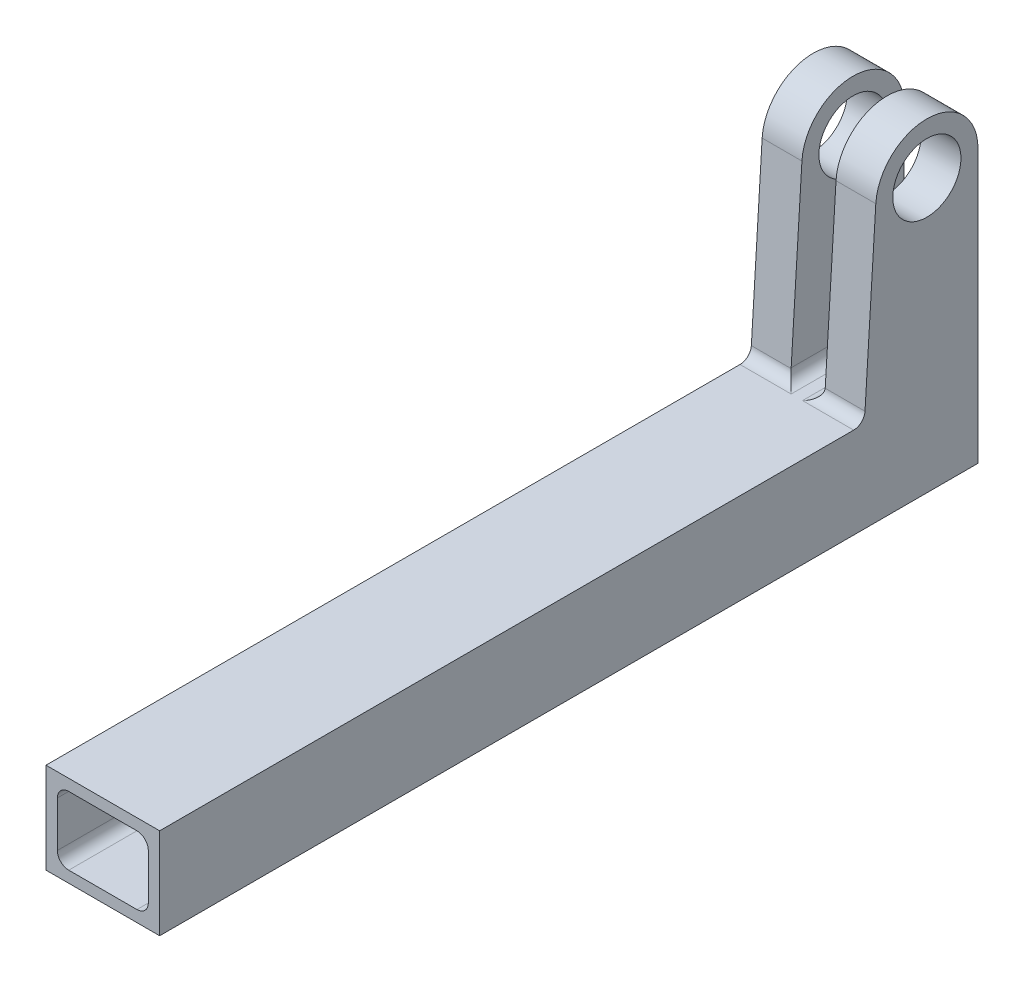
ISO-10303-21;
HEADER;
FILE_DESCRIPTION(('STEP AP214'),'2;1');
FILE_NAME('part.step','',(''),(''),'','','');
FILE_SCHEMA(('AUTOMOTIVE_DESIGN { 1 0 10303 214 1 1 1 1 }'));
ENDSEC;
DATA;
#1=APPLICATION_CONTEXT('core data for automotive mechanical design processes');
#2=APPLICATION_PROTOCOL_DEFINITION('international standard','automotive_design',2000,#1);
#3=PRODUCT_CONTEXT('',#1,'mechanical');
#4=PRODUCT('Part','Part','',(#3));
#5=PRODUCT_RELATED_PRODUCT_CATEGORY('part','',(#4));
#6=PRODUCT_DEFINITION_FORMATION('','',#4);
#7=PRODUCT_DEFINITION_CONTEXT('part definition',#1,'design');
#8=PRODUCT_DEFINITION('design','',#6,#7);
#9=PRODUCT_DEFINITION_SHAPE('','',#8);
#10=(LENGTH_UNIT() NAMED_UNIT(*) SI_UNIT(.MILLI.,.METRE.));
#11=(NAMED_UNIT(*) PLANE_ANGLE_UNIT() SI_UNIT($,.RADIAN.));
#12=(NAMED_UNIT(*) SI_UNIT($,.STERADIAN.) SOLID_ANGLE_UNIT());
#13=UNCERTAINTY_MEASURE_WITH_UNIT(LENGTH_MEASURE(1.E-05),#10,'distance_accuracy_value','');
#14=(GEOMETRIC_REPRESENTATION_CONTEXT(3) GLOBAL_UNCERTAINTY_ASSIGNED_CONTEXT((#13)) GLOBAL_UNIT_ASSIGNED_CONTEXT((#10,
#11,#12)) REPRESENTATION_CONTEXT('',''));
#15=CARTESIAN_POINT('',(0.,0.,0.));
#16=DIRECTION('',(0.,0.,1.));
#17=DIRECTION('',(1.,0.,0.));
#18=AXIS2_PLACEMENT_3D('',#15,#16,#17);
#19=CARTESIAN_POINT('',(0.,101.6,914.4));
#20=DIRECTION('',(0.,-1.,0.));
#21=DIRECTION('',(1.,0.,0.));
#22=AXIS2_PLACEMENT_3D('',#19,#20,#21);
#23=PLANE('',#22);
#24=DIRECTION('',(0.,0.,1.));
#25=VECTOR('',#24,1.);
#26=CARTESIAN_POINT('',(-69.8500000000001,101.6,127.));
#27=LINE('',#26,#25);
#28=CARTESIAN_POINT('',(-69.8500000000001,101.6,0.));
#29=VERTEX_POINT('',#28);
#30=CARTESIAN_POINT('',(-69.8500000000001,101.6,138.937454927375));
#31=VERTEX_POINT('',#30);
#32=EDGE_CURVE('E346',#29,#31,#27,.T.);
#33=ORIENTED_EDGE('',*,*,#32,.T.);
#34=DIRECTION('',(-1.,0.,0.));
#35=VECTOR('',#34,1.);
#36=CARTESIAN_POINT('',(0.,101.6,138.937454927375));
#37=LINE('',#36,#35);
#38=CARTESIAN_POINT('',(-127.,101.6,138.937454927375));
#39=VERTEX_POINT('',#38);
#40=EDGE_CURVE('E348',#31,#39,#37,.T.);
#41=ORIENTED_EDGE('',*,*,#40,.T.);
#42=DIRECTION('',(0.,0.,-1.));
#43=VECTOR('',#42,1.);
#44=CARTESIAN_POINT('',(-127.,101.6,914.4));
#45=LINE('',#44,#43);
#46=CARTESIAN_POINT('',(-127.,101.6,914.4));
#47=VERTEX_POINT('',#46);
#48=EDGE_CURVE('E300',#47,#39,#45,.T.);
#49=ORIENTED_EDGE('',*,*,#48,.F.);
#50=DIRECTION('',(-1.,0.,0.));
#51=VECTOR('',#50,1.);
#52=CARTESIAN_POINT('',(0.,101.6,914.4));
#53=LINE('',#52,#51);
#54=CARTESIAN_POINT('',(0.,101.6,914.4));
#55=VERTEX_POINT('',#54);
#56=EDGE_CURVE('E281',#55,#47,#53,.T.);
#57=ORIENTED_EDGE('',*,*,#56,.F.);
#58=DIRECTION('',(0.,0.,-1.));
#59=VECTOR('',#58,1.);
#60=CARTESIAN_POINT('',(0.,101.6,914.4));
#61=LINE('',#60,#59);
#62=CARTESIAN_POINT('',(0.,101.6,138.937454927375));
#63=VERTEX_POINT('',#62);
#64=EDGE_CURVE('E303',#55,#63,#61,.T.);
#65=ORIENTED_EDGE('',*,*,#64,.T.);
#66=DIRECTION('',(1.,0.,0.));
#67=VECTOR('',#66,1.);
#68=CARTESIAN_POINT('',(0.,101.6,138.937454927375));
#69=LINE('',#68,#67);
#70=CARTESIAN_POINT('',(-57.15,101.6,138.937454927375));
#71=VERTEX_POINT('',#70);
#72=EDGE_CURVE('E344',#63,#71,#69,.F.);
#73=ORIENTED_EDGE('',*,*,#72,.T.);
#74=DIRECTION('',(0.,0.,-1.));
#75=VECTOR('',#74,1.);
#76=CARTESIAN_POINT('',(-57.15,101.6,0.));
#77=LINE('',#76,#75);
#78=CARTESIAN_POINT('',(-57.15,101.6,0.));
#79=VERTEX_POINT('',#78);
#80=EDGE_CURVE('E342',#71,#79,#77,.T.);
#81=ORIENTED_EDGE('',*,*,#80,.T.);
#82=DIRECTION('',(-1.,0.,0.));
#83=VECTOR('',#82,1.);
#84=CARTESIAN_POINT('',(0.,101.6,0.));
#85=LINE('',#84,#83);
#86=EDGE_CURVE('E290',#79,#29,#85,.T.);
#87=ORIENTED_EDGE('',*,*,#86,.T.);
#88=EDGE_LOOP('',(#33,#41,#49,#57,#65,#73,#81,#87));
#89=FACE_BOUND('',#88,.T.);
#90=ADVANCED_FACE('F37',(#89),#23,.F.);
#91=CARTESIAN_POINT('',(0.,0.,914.4));
#92=DIRECTION('',(0.,0.,-1.));
#93=DIRECTION('',(-1.,0.,0.));
#94=AXIS2_PLACEMENT_3D('',#91,#92,#93);
#95=PLANE('',#94);
#96=DIRECTION('',(0.,1.,0.));
#97=VECTOR('',#96,1.);
#98=CARTESIAN_POINT('',(0.,101.6,914.4));
#99=LINE('',#98,#97);
#100=CARTESIAN_POINT('',(0.,0.,914.4));
#101=VERTEX_POINT('',#100);
#102=EDGE_CURVE('E278',#101,#55,#99,.T.);
#103=ORIENTED_EDGE('',*,*,#102,.T.);
#104=ORIENTED_EDGE('',*,*,#56,.T.);
#105=DIRECTION('',(0.,-1.,0.));
#106=VECTOR('',#105,1.);
#107=CARTESIAN_POINT('',(-127.,101.6,914.4));
#108=LINE('',#107,#106);
#109=CARTESIAN_POINT('',(-127.,0.,914.4));
#110=VERTEX_POINT('',#109);
#111=EDGE_CURVE('E284',#47,#110,#108,.T.);
#112=ORIENTED_EDGE('',*,*,#111,.T.);
#113=DIRECTION('',(1.,0.,0.));
#114=VECTOR('',#113,1.);
#115=CARTESIAN_POINT('',(0.,0.,914.4));
#116=LINE('',#115,#114);
#117=EDGE_CURVE('E286',#110,#101,#116,.T.);
#118=ORIENTED_EDGE('',*,*,#117,.T.);
#119=EDGE_LOOP('',(#103,#104,#112,#118));
#120=FACE_BOUND('',#119,.T.);
#121=DIRECTION('',(-1.,0.,0.));
#122=VECTOR('',#121,1.);
#123=CARTESIAN_POINT('',(-12.7,88.9,914.4));
#124=LINE('',#123,#122);
#125=CARTESIAN_POINT('',(-25.4,88.9,914.4));
#126=VERTEX_POINT('',#125);
#127=CARTESIAN_POINT('',(-101.6,88.9,914.4));
#128=VERTEX_POINT('',#127);
#129=EDGE_CURVE('E254',#126,#128,#124,.T.);
#130=ORIENTED_EDGE('',*,*,#129,.F.);
#131=CARTESIAN_POINT('',(-25.4,76.2,914.4));
#132=DIRECTION('',(0.,0.,-1.));
#133=DIRECTION('',(-1.,0.,0.));
#134=AXIS2_PLACEMENT_3D('',#131,#132,#133);
#135=CIRCLE('',#134,12.7);
#136=CARTESIAN_POINT('',(-12.7,76.2,914.4));
#137=VERTEX_POINT('',#136);
#138=EDGE_CURVE('E332',#126,#137,#135,.T.);
#139=ORIENTED_EDGE('',*,*,#138,.T.);
#140=DIRECTION('',(0.,1.,0.));
#141=VECTOR('',#140,1.);
#142=CARTESIAN_POINT('',(-12.7,88.9,914.4));
#143=LINE('',#142,#141);
#144=CARTESIAN_POINT('',(-12.7,25.4,914.4));
#145=VERTEX_POINT('',#144);
#146=EDGE_CURVE('E264',#145,#137,#143,.T.);
#147=ORIENTED_EDGE('',*,*,#146,.F.);
#148=CARTESIAN_POINT('',(-25.4,25.4,914.4));
#149=DIRECTION('',(0.,0.,-1.));
#150=DIRECTION('',(-1.,0.,0.));
#151=AXIS2_PLACEMENT_3D('',#148,#149,#150);
#152=CIRCLE('',#151,12.7);
#153=CARTESIAN_POINT('',(-25.4,12.7,914.4));
#154=VERTEX_POINT('',#153);
#155=EDGE_CURVE('E328',#145,#154,#152,.T.);
#156=ORIENTED_EDGE('',*,*,#155,.T.);
#157=DIRECTION('',(1.,0.,0.));
#158=VECTOR('',#157,1.);
#159=CARTESIAN_POINT('',(-12.7,12.7,914.4));
#160=LINE('',#159,#158);
#161=CARTESIAN_POINT('',(-101.6,12.7,914.4));
#162=VERTEX_POINT('',#161);
#163=EDGE_CURVE('E261',#162,#154,#160,.T.);
#164=ORIENTED_EDGE('',*,*,#163,.F.);
#165=CARTESIAN_POINT('',(-101.6,25.4,914.4));
#166=DIRECTION('',(0.,0.,-1.));
#167=DIRECTION('',(-1.,0.,0.));
#168=AXIS2_PLACEMENT_3D('',#165,#166,#167);
#169=CIRCLE('',#168,12.7);
#170=CARTESIAN_POINT('',(-114.3,25.4,914.4));
#171=VERTEX_POINT('',#170);
#172=EDGE_CURVE('E340',#162,#171,#169,.T.);
#173=ORIENTED_EDGE('',*,*,#172,.T.);
#174=DIRECTION('',(0.,-1.,0.));
#175=VECTOR('',#174,1.);
#176=CARTESIAN_POINT('',(-114.3,88.9,914.4));
#177=LINE('',#176,#175);
#178=CARTESIAN_POINT('',(-114.3,76.2,914.4));
#179=VERTEX_POINT('',#178);
#180=EDGE_CURVE('E257',#179,#171,#177,.T.);
#181=ORIENTED_EDGE('',*,*,#180,.F.);
#182=CARTESIAN_POINT('',(-101.6,76.2,914.4));
#183=DIRECTION('',(0.,0.,-1.));
#184=DIRECTION('',(-1.,0.,0.));
#185=AXIS2_PLACEMENT_3D('',#182,#183,#184);
#186=CIRCLE('',#185,12.7);
#187=EDGE_CURVE('E336',#179,#128,#186,.T.);
#188=ORIENTED_EDGE('',*,*,#187,.T.);
#189=EDGE_LOOP('',(#130,#139,#147,#156,#164,#173,#181,#188));
#190=FACE_BOUND('',#189,.T.);
#191=ADVANCED_FACE('F392',(#120,#190),#95,.F.);
#192=CARTESIAN_POINT('',(0.,0.,0.));
#193=DIRECTION('',(0.,0.,-1.));
#194=DIRECTION('',(-1.,0.,0.));
#195=AXIS2_PLACEMENT_3D('',#192,#193,#194);
#196=PLANE('',#195);
#197=DIRECTION('',(0.,1.,0.));
#198=VECTOR('',#197,1.);
#199=CARTESIAN_POINT('',(0.,101.6,0.));
#200=LINE('',#199,#198);
#201=CARTESIAN_POINT('',(0.,0.,0.));
#202=VERTEX_POINT('',#201);
#203=CARTESIAN_POINT('',(0.,304.8,0.));
#204=VERTEX_POINT('',#203);
#205=EDGE_CURVE('E267',#202,#204,#200,.T.);
#206=ORIENTED_EDGE('',*,*,#205,.F.);
#207=DIRECTION('',(1.,0.,0.));
#208=VECTOR('',#207,1.);
#209=CARTESIAN_POINT('',(0.,0.,0.));
#210=LINE('',#209,#208);
#211=CARTESIAN_POINT('',(-127.,0.,0.));
#212=VERTEX_POINT('',#211);
#213=EDGE_CURVE('E282',#212,#202,#210,.T.);
#214=ORIENTED_EDGE('',*,*,#213,.F.);
#215=DIRECTION('',(0.,-1.,0.));
#216=VECTOR('',#215,1.);
#217=CARTESIAN_POINT('',(-127.,101.6,0.));
#218=LINE('',#217,#216);
#219=CARTESIAN_POINT('',(-127.,304.8,0.));
#220=VERTEX_POINT('',#219);
#221=EDGE_CURVE('E197',#220,#212,#218,.T.);
#222=ORIENTED_EDGE('',*,*,#221,.F.);
#223=DIRECTION('',(-1.,0.,0.));
#224=VECTOR('',#223,1.);
#225=CARTESIAN_POINT('',(-82.5500000000002,304.8,0.));
#226=LINE('',#225,#224);
#227=CARTESIAN_POINT('',(-82.5500000000002,304.8,0.));
#228=VERTEX_POINT('',#227);
#229=EDGE_CURVE('E189',#228,#220,#226,.T.);
#230=ORIENTED_EDGE('',*,*,#229,.F.);
#231=DIRECTION('',(0.,-1.,0.));
#232=VECTOR('',#231,1.);
#233=CARTESIAN_POINT('',(-82.5500000000002,304.8,0.));
#234=LINE('',#233,#232);
#235=CARTESIAN_POINT('',(-82.5500000000001,114.3,0.));
#236=VERTEX_POINT('',#235);
#237=EDGE_CURVE('E194',#228,#236,#234,.T.);
#238=ORIENTED_EDGE('',*,*,#237,.T.);
#239=CARTESIAN_POINT('',(-69.8500000000001,114.3,0.));
#240=DIRECTION('',(0.,0.,-1.));
#241=DIRECTION('',(-1.,0.,0.));
#242=AXIS2_PLACEMENT_3D('',#239,#240,#241);
#243=CIRCLE('',#242,12.7);
#244=EDGE_CURVE('E362',#236,#29,#243,.F.);
#245=ORIENTED_EDGE('',*,*,#244,.T.);
#246=ORIENTED_EDGE('',*,*,#86,.F.);
#247=CARTESIAN_POINT('',(-57.15,114.3,0.));
#248=DIRECTION('',(0.,0.,-1.));
#249=DIRECTION('',(-1.,0.,0.));
#250=AXIS2_PLACEMENT_3D('',#247,#248,#249);
#251=CIRCLE('',#250,12.7);
#252=CARTESIAN_POINT('',(-44.45,114.3,0.));
#253=VERTEX_POINT('',#252);
#254=EDGE_CURVE('E46',#79,#253,#251,.F.);
#255=ORIENTED_EDGE('',*,*,#254,.T.);
#256=DIRECTION('',(0.,1.,0.));
#257=VECTOR('',#256,1.);
#258=CARTESIAN_POINT('',(-44.45,0.,0.));
#259=LINE('',#258,#257);
#260=CARTESIAN_POINT('',(-44.45,304.8,0.));
#261=VERTEX_POINT('',#260);
#262=EDGE_CURVE('E232',#253,#261,#259,.T.);
#263=ORIENTED_EDGE('',*,*,#262,.T.);
#264=DIRECTION('',(1.,0.,0.));
#265=VECTOR('',#264,1.);
#266=CARTESIAN_POINT('',(-44.45,304.8,0.));
#267=LINE('',#266,#265);
#268=EDGE_CURVE('E241',#261,#204,#267,.T.);
#269=ORIENTED_EDGE('',*,*,#268,.T.);
#270=EDGE_LOOP('',(#206,#214,#222,#230,#238,#245,#246,#255,#263,#269));
#271=FACE_BOUND('',#270,.T.);
#272=DIRECTION('',(1.,0.,0.));
#273=VECTOR('',#272,1.);
#274=CARTESIAN_POINT('',(-12.7,12.7,0.));
#275=LINE('',#274,#273);
#276=CARTESIAN_POINT('',(-101.6,12.7,0.));
#277=VERTEX_POINT('',#276);
#278=CARTESIAN_POINT('',(-25.4,12.7,0.));
#279=VERTEX_POINT('',#278);
#280=EDGE_CURVE('E273',#277,#279,#275,.T.);
#281=ORIENTED_EDGE('',*,*,#280,.T.);
#282=CARTESIAN_POINT('',(-25.4,25.4,0.));
#283=DIRECTION('',(0.,0.,-1.));
#284=DIRECTION('',(-1.,0.,0.));
#285=AXIS2_PLACEMENT_3D('',#282,#283,#284);
#286=CIRCLE('',#285,12.7);
#287=CARTESIAN_POINT('',(-12.7,25.4,0.));
#288=VERTEX_POINT('',#287);
#289=EDGE_CURVE('E326',#279,#288,#286,.F.);
#290=ORIENTED_EDGE('',*,*,#289,.T.);
#291=DIRECTION('',(0.,1.,0.));
#292=VECTOR('',#291,1.);
#293=CARTESIAN_POINT('',(-12.7,88.9,0.));
#294=LINE('',#293,#292);
#295=CARTESIAN_POINT('',(-12.7,76.2,0.));
#296=VERTEX_POINT('',#295);
#297=EDGE_CURVE('E258',#288,#296,#294,.T.);
#298=ORIENTED_EDGE('',*,*,#297,.T.);
#299=CARTESIAN_POINT('',(-25.4,76.2,0.));
#300=DIRECTION('',(0.,0.,-1.));
#301=DIRECTION('',(-1.,0.,0.));
#302=AXIS2_PLACEMENT_3D('',#299,#300,#301);
#303=CIRCLE('',#302,12.7);
#304=CARTESIAN_POINT('',(-25.4,88.9,0.));
#305=VERTEX_POINT('',#304);
#306=EDGE_CURVE('E330',#296,#305,#303,.F.);
#307=ORIENTED_EDGE('',*,*,#306,.T.);
#308=DIRECTION('',(-1.,0.,0.));
#309=VECTOR('',#308,1.);
#310=CARTESIAN_POINT('',(-12.7,88.9,0.));
#311=LINE('',#310,#309);
#312=CARTESIAN_POINT('',(-101.6,88.9,0.));
#313=VERTEX_POINT('',#312);
#314=EDGE_CURVE('E251',#305,#313,#311,.T.);
#315=ORIENTED_EDGE('',*,*,#314,.T.);
#316=CARTESIAN_POINT('',(-101.6,76.2,0.));
#317=DIRECTION('',(0.,0.,-1.));
#318=DIRECTION('',(-1.,0.,0.));
#319=AXIS2_PLACEMENT_3D('',#316,#317,#318);
#320=CIRCLE('',#319,12.7);
#321=CARTESIAN_POINT('',(-114.3,76.2,0.));
#322=VERTEX_POINT('',#321);
#323=EDGE_CURVE('E334',#313,#322,#320,.F.);
#324=ORIENTED_EDGE('',*,*,#323,.T.);
#325=DIRECTION('',(0.,-1.,0.));
#326=VECTOR('',#325,1.);
#327=CARTESIAN_POINT('',(-114.3,88.9,0.));
#328=LINE('',#327,#326);
#329=CARTESIAN_POINT('',(-114.3,25.4,0.));
#330=VERTEX_POINT('',#329);
#331=EDGE_CURVE('E270',#322,#330,#328,.T.);
#332=ORIENTED_EDGE('',*,*,#331,.T.);
#333=CARTESIAN_POINT('',(-101.6,25.4,0.));
#334=DIRECTION('',(0.,0.,-1.));
#335=DIRECTION('',(-1.,0.,0.));
#336=AXIS2_PLACEMENT_3D('',#333,#334,#335);
#337=CIRCLE('',#336,12.7);
#338=EDGE_CURVE('E338',#330,#277,#337,.F.);
#339=ORIENTED_EDGE('',*,*,#338,.T.);
#340=EDGE_LOOP('',(#281,#290,#298,#307,#315,#324,#332,#339));
#341=FACE_BOUND('',#340,.T.);
#342=ADVANCED_FACE('F192',(#271,#341),#196,.T.);
#343=CARTESIAN_POINT('',(0.,101.6,914.4));
#344=DIRECTION('',(-1.,0.,0.));
#345=DIRECTION('',(0.,-1.,0.));
#346=AXIS2_PLACEMENT_3D('',#343,#344,#345);
#347=PLANE('',#346);
#348=ORIENTED_EDGE('',*,*,#205,.T.);
#349=CARTESIAN_POINT('',(0.,304.8,57.15));
#350=DIRECTION('',(1.,0.,0.));
#351=DIRECTION('',(0.,0.,-1.));
#352=AXIS2_PLACEMENT_3D('',#349,#350,#351);
#353=CIRCLE('',#352,57.15);
#354=CARTESIAN_POINT('',(0.,308.334272868835,114.190611982066));
#355=VERTEX_POINT('',#354);
#356=EDGE_CURVE('E244',#204,#355,#353,.T.);
#357=ORIENTED_EDGE('',*,*,#356,.T.);
#358=DIRECTION('',(0.,-0.998085948942538,0.0618420449489973));
#359=VECTOR('',#358,1.);
#360=CARTESIAN_POINT('',(0.,8.22746982090325,132.785421801053));
#361=LINE('',#360,#359);
#362=CARTESIAN_POINT('',(0.,113.514606029148,126.261763375805));
#363=VERTEX_POINT('',#362);
#364=EDGE_CURVE('E233',#355,#363,#361,.T.);
#365=ORIENTED_EDGE('',*,*,#364,.T.);
#366=CARTESIAN_POINT('',(0.,114.3,138.937454927375));
#367=DIRECTION('',(-1.,0.,0.));
#368=DIRECTION('',(0.,-1.,0.));
#369=AXIS2_PLACEMENT_3D('',#366,#367,#368);
#370=CIRCLE('',#369,12.7);
#371=EDGE_CURVE('E358',#363,#63,#370,.T.);
#372=ORIENTED_EDGE('',*,*,#371,.T.);
#373=ORIENTED_EDGE('',*,*,#64,.F.);
#374=ORIENTED_EDGE('',*,*,#102,.F.);
#375=DIRECTION('',(0.,0.,-1.));
#376=VECTOR('',#375,1.);
#377=CARTESIAN_POINT('',(0.,0.,914.4));
#378=LINE('',#377,#376);
#379=EDGE_CURVE('E288',#101,#202,#378,.T.);
#380=ORIENTED_EDGE('',*,*,#379,.T.);
#381=EDGE_LOOP('',(#348,#357,#365,#372,#373,#374,#380));
#382=FACE_BOUND('',#381,.T.);
#383=CARTESIAN_POINT('',(0.,304.8,57.15));
#384=DIRECTION('',(1.,0.,0.));
#385=DIRECTION('',(0.,0.,-1.));
#386=AXIS2_PLACEMENT_3D('',#383,#384,#385);
#387=CIRCLE('',#386,38.1);
#388=CARTESIAN_POINT('',(0.,304.8,19.05));
#389=VERTEX_POINT('',#388);
#390=EDGE_CURVE('E227',#389,#389,#387,.T.);
#391=ORIENTED_EDGE('',*,*,#390,.F.);
#392=EDGE_LOOP('',(#391));
#393=FACE_BOUND('',#392,.T.);
#394=ADVANCED_FACE('F398',(#382,#393),#347,.F.);
#395=CARTESIAN_POINT('',(-127.,101.6,914.4));
#396=DIRECTION('',(1.,0.,0.));
#397=DIRECTION('',(0.,1.,0.));
#398=AXIS2_PLACEMENT_3D('',#395,#396,#397);
#399=PLANE('',#398);
#400=ORIENTED_EDGE('',*,*,#221,.T.);
#401=DIRECTION('',(0.,0.,-1.));
#402=VECTOR('',#401,1.);
#403=CARTESIAN_POINT('',(-127.,0.,914.4));
#404=LINE('',#403,#402);
#405=EDGE_CURVE('E297',#110,#212,#404,.T.);
#406=ORIENTED_EDGE('',*,*,#405,.F.);
#407=ORIENTED_EDGE('',*,*,#111,.F.);
#408=ORIENTED_EDGE('',*,*,#48,.T.);
#409=CARTESIAN_POINT('',(-127.,114.3,138.937454927375));
#410=DIRECTION('',(1.,0.,0.));
#411=DIRECTION('',(0.,1.,0.));
#412=AXIS2_PLACEMENT_3D('',#409,#410,#411);
#413=CIRCLE('',#412,12.7);
#414=CARTESIAN_POINT('',(-127.,113.514606029148,126.261763375805));
#415=VERTEX_POINT('',#414);
#416=EDGE_CURVE('E356',#39,#415,#413,.T.);
#417=ORIENTED_EDGE('',*,*,#416,.T.);
#418=DIRECTION('',(0.,0.998085948942538,-0.0618420449489972));
#419=VECTOR('',#418,1.);
#420=CARTESIAN_POINT('',(-127.,101.6,127.));
#421=LINE('',#420,#419);
#422=CARTESIAN_POINT('',(-127.,308.334272868835,114.190611982066));
#423=VERTEX_POINT('',#422);
#424=EDGE_CURVE('E216',#415,#423,#421,.T.);
#425=ORIENTED_EDGE('',*,*,#424,.T.);
#426=CARTESIAN_POINT('',(-127.,304.8,57.15));
#427=DIRECTION('',(-1.,0.,0.));
#428=DIRECTION('',(0.,-1.,0.));
#429=AXIS2_PLACEMENT_3D('',#426,#427,#428);
#430=CIRCLE('',#429,57.15);
#431=EDGE_CURVE('E218',#423,#220,#430,.T.);
#432=ORIENTED_EDGE('',*,*,#431,.T.);
#433=EDGE_LOOP('',(#400,#406,#407,#408,#417,#425,#432));
#434=FACE_BOUND('',#433,.T.);
#435=CARTESIAN_POINT('',(-127.,304.8,57.15));
#436=DIRECTION('',(-1.,0.,0.));
#437=DIRECTION('',(0.,-1.,0.));
#438=AXIS2_PLACEMENT_3D('',#435,#436,#437);
#439=CIRCLE('',#438,38.1);
#440=CARTESIAN_POINT('',(-127.,266.7,57.15));
#441=VERTEX_POINT('',#440);
#442=EDGE_CURVE('E221',#441,#441,#439,.T.);
#443=ORIENTED_EDGE('',*,*,#442,.F.);
#444=EDGE_LOOP('',(#443));
#445=FACE_BOUND('',#444,.T.);
#446=ADVANCED_FACE('F387',(#434,#445),#399,.F.);
#447=CARTESIAN_POINT('',(0.,0.,914.4));
#448=DIRECTION('',(0.,1.,0.));
#449=DIRECTION('',(-1.,0.,0.));
#450=AXIS2_PLACEMENT_3D('',#447,#448,#449);
#451=PLANE('',#450);
#452=ORIENTED_EDGE('',*,*,#213,.T.);
#453=ORIENTED_EDGE('',*,*,#379,.F.);
#454=ORIENTED_EDGE('',*,*,#117,.F.);
#455=ORIENTED_EDGE('',*,*,#405,.T.);
#456=EDGE_LOOP('',(#452,#453,#454,#455));
#457=FACE_BOUND('',#456,.T.);
#458=ADVANCED_FACE('F412',(#457),#451,.F.);
#459=CARTESIAN_POINT('',(-12.7,88.9,914.4));
#460=DIRECTION('',(0.,-1.,0.));
#461=DIRECTION('',(1.,0.,0.));
#462=AXIS2_PLACEMENT_3D('',#459,#460,#461);
#463=PLANE('',#462);
#464=ORIENTED_EDGE('',*,*,#314,.F.);
#465=DIRECTION('',(0.,0.,-1.));
#466=VECTOR('',#465,1.);
#467=CARTESIAN_POINT('',(-25.4,88.9,914.4));
#468=LINE('',#467,#466);
#469=EDGE_CURVE('E319',#305,#126,#468,.F.);
#470=ORIENTED_EDGE('',*,*,#469,.T.);
#471=ORIENTED_EDGE('',*,*,#129,.T.);
#472=DIRECTION('',(0.,0.,-1.));
#473=VECTOR('',#472,1.);
#474=CARTESIAN_POINT('',(-101.6,88.9,0.));
#475=LINE('',#474,#473);
#476=EDGE_CURVE('E316',#128,#313,#475,.T.);
#477=ORIENTED_EDGE('',*,*,#476,.T.);
#478=EDGE_LOOP('',(#464,#470,#471,#477));
#479=FACE_BOUND('',#478,.T.);
#480=ADVANCED_FACE('F414',(#479),#463,.T.);
#481=CARTESIAN_POINT('',(-114.3,88.9,914.4));
#482=DIRECTION('',(1.,0.,0.));
#483=DIRECTION('',(0.,1.,0.));
#484=AXIS2_PLACEMENT_3D('',#481,#482,#483);
#485=PLANE('',#484);
#486=ORIENTED_EDGE('',*,*,#331,.F.);
#487=DIRECTION('',(0.,0.,-1.));
#488=VECTOR('',#487,1.);
#489=CARTESIAN_POINT('',(-114.3,76.2,914.4));
#490=LINE('',#489,#488);
#491=EDGE_CURVE('E324',#322,#179,#490,.F.);
#492=ORIENTED_EDGE('',*,*,#491,.T.);
#493=ORIENTED_EDGE('',*,*,#180,.T.);
#494=DIRECTION('',(0.,0.,-1.));
#495=VECTOR('',#494,1.);
#496=CARTESIAN_POINT('',(-114.3,25.4,0.));
#497=LINE('',#496,#495);
#498=EDGE_CURVE('E321',#171,#330,#497,.T.);
#499=ORIENTED_EDGE('',*,*,#498,.T.);
#500=EDGE_LOOP('',(#486,#492,#493,#499));
#501=FACE_BOUND('',#500,.T.);
#502=ADVANCED_FACE('F420',(#501),#485,.T.);
#503=CARTESIAN_POINT('',(-12.7,12.7,914.4));
#504=DIRECTION('',(0.,1.,0.));
#505=DIRECTION('',(-1.,0.,0.));
#506=AXIS2_PLACEMENT_3D('',#503,#504,#505);
#507=PLANE('',#506);
#508=ORIENTED_EDGE('',*,*,#163,.T.);
#509=DIRECTION('',(0.,0.,-1.));
#510=VECTOR('',#509,1.);
#511=CARTESIAN_POINT('',(-25.4,12.7,0.));
#512=LINE('',#511,#510);
#513=EDGE_CURVE('E308',#154,#279,#512,.T.);
#514=ORIENTED_EDGE('',*,*,#513,.T.);
#515=ORIENTED_EDGE('',*,*,#280,.F.);
#516=DIRECTION('',(0.,0.,-1.));
#517=VECTOR('',#516,1.);
#518=CARTESIAN_POINT('',(-101.6,12.7,914.4));
#519=LINE('',#518,#517);
#520=EDGE_CURVE('E306',#277,#162,#519,.F.);
#521=ORIENTED_EDGE('',*,*,#520,.T.);
#522=EDGE_LOOP('',(#508,#514,#515,#521));
#523=FACE_BOUND('',#522,.T.);
#524=ADVANCED_FACE('F548',(#523),#507,.T.);
#525=CARTESIAN_POINT('',(-12.7,88.9,914.4));
#526=DIRECTION('',(-1.,0.,0.));
#527=DIRECTION('',(0.,-1.,0.));
#528=AXIS2_PLACEMENT_3D('',#525,#526,#527);
#529=PLANE('',#528);
#530=ORIENTED_EDGE('',*,*,#297,.F.);
#531=DIRECTION('',(0.,0.,-1.));
#532=VECTOR('',#531,1.);
#533=CARTESIAN_POINT('',(-12.7,25.4,914.4));
#534=LINE('',#533,#532);
#535=EDGE_CURVE('E314',#288,#145,#534,.F.);
#536=ORIENTED_EDGE('',*,*,#535,.T.);
#537=ORIENTED_EDGE('',*,*,#146,.T.);
#538=DIRECTION('',(0.,0.,-1.));
#539=VECTOR('',#538,1.);
#540=CARTESIAN_POINT('',(-12.7,76.2,0.));
#541=LINE('',#540,#539);
#542=EDGE_CURVE('E311',#137,#296,#541,.T.);
#543=ORIENTED_EDGE('',*,*,#542,.T.);
#544=EDGE_LOOP('',(#530,#536,#537,#543));
#545=FACE_BOUND('',#544,.T.);
#546=ADVANCED_FACE('F541',(#545),#529,.T.);
#547=CARTESIAN_POINT('',(-44.45,8.22746982090325,132.785421801053));
#548=DIRECTION('',(0.,0.0618420449489973,0.998085948942538));
#549=DIRECTION('',(0.,-0.998085948942538,0.0618420449489973));
#550=AXIS2_PLACEMENT_3D('',#547,#548,#549);
#551=PLANE('',#550);
#552=DIRECTION('',(0.,-0.998085948942538,0.0618420449489973));
#553=VECTOR('',#552,1.);
#554=CARTESIAN_POINT('',(-44.45,8.22746982090325,132.785421801053));
#555=LINE('',#554,#553);
#556=CARTESIAN_POINT('',(-44.45,308.334272868835,114.190611982066));
#557=VERTEX_POINT('',#556);
#558=CARTESIAN_POINT('',(-44.45,114.3,126.213099862107));
#559=VERTEX_POINT('',#558);
#560=EDGE_CURVE('E238',#557,#559,#555,.T.);
#561=ORIENTED_EDGE('',*,*,#560,.T.);
#562=CARTESIAN_POINT('',(-57.15,114.3,126.213099862107));
#563=DIRECTION('',(0.,0.0618420449489973,0.998085948942538));
#564=DIRECTION('',(0.,-0.998085948942538,0.0618420449489973));
#565=AXIS2_PLACEMENT_3D('',#562,#563,#564);
#566=ELLIPSE('',#565,12.7243550652682,12.7);
#567=CARTESIAN_POINT('',(-44.4743084484298,113.514606029148,126.261763375805));
#568=VERTEX_POINT('',#567);
#569=EDGE_CURVE('E11',#559,#568,#566,.F.);
#570=ORIENTED_EDGE('',*,*,#569,.T.);
#571=DIRECTION('',(1.,0.,0.));
#572=VECTOR('',#571,1.);
#573=CARTESIAN_POINT('',(-44.45,113.514606029148,126.261763375805));
#574=LINE('',#573,#572);
#575=EDGE_CURVE('E54',#568,#363,#574,.T.);
#576=ORIENTED_EDGE('',*,*,#575,.T.);
#577=ORIENTED_EDGE('',*,*,#364,.F.);
#578=DIRECTION('',(1.,0.,0.));
#579=VECTOR('',#578,1.);
#580=CARTESIAN_POINT('',(-44.45,308.334272868835,114.190611982066));
#581=LINE('',#580,#579);
#582=EDGE_CURVE('E249',#557,#355,#581,.T.);
#583=ORIENTED_EDGE('',*,*,#582,.F.);
#584=EDGE_LOOP('',(#561,#570,#576,#577,#583));
#585=FACE_BOUND('',#584,.T.);
#586=ADVANCED_FACE('F402',(#585),#551,.T.);
#587=CARTESIAN_POINT('',(-44.45,304.8,57.15));
#588=DIRECTION('',(1.,0.,0.));
#589=DIRECTION('',(0.,0.,-1.));
#590=AXIS2_PLACEMENT_3D('',#587,#588,#589);
#591=CYLINDRICAL_SURFACE('',#590,38.1);
#592=CARTESIAN_POINT('',(-44.45,304.8,57.15));
#593=DIRECTION('',(1.,0.,0.));
#594=DIRECTION('',(0.,0.,-1.));
#595=AXIS2_PLACEMENT_3D('',#592,#593,#594);
#596=CIRCLE('',#595,38.1);
#597=CARTESIAN_POINT('',(-44.45,304.8,19.05));
#598=VERTEX_POINT('',#597);
#599=EDGE_CURVE('E229',#598,#598,#596,.T.);
#600=ORIENTED_EDGE('',*,*,#599,.F.);
#601=EDGE_LOOP('',(#600));
#602=FACE_BOUND('',#601,.T.);
#603=ORIENTED_EDGE('',*,*,#390,.T.);
#604=EDGE_LOOP('',(#603));
#605=FACE_BOUND('',#604,.T.);
#606=ADVANCED_FACE('F528',(#602,#605),#591,.F.);
#607=CARTESIAN_POINT('',(-44.45,304.8,57.15));
#608=DIRECTION('',(1.,0.,0.));
#609=DIRECTION('',(0.,0.,-1.));
#610=AXIS2_PLACEMENT_3D('',#607,#608,#609);
#611=CYLINDRICAL_SURFACE('',#610,57.15);
#612=ORIENTED_EDGE('',*,*,#356,.F.);
#613=ORIENTED_EDGE('',*,*,#268,.F.);
#614=CARTESIAN_POINT('',(-44.45,304.8,57.15));
#615=DIRECTION('',(1.,0.,0.));
#616=DIRECTION('',(0.,0.,-1.));
#617=AXIS2_PLACEMENT_3D('',#614,#615,#616);
#618=CIRCLE('',#617,57.15);
#619=EDGE_CURVE('E235',#261,#557,#618,.T.);
#620=ORIENTED_EDGE('',*,*,#619,.T.);
#621=ORIENTED_EDGE('',*,*,#582,.T.);
#622=EDGE_LOOP('',(#612,#613,#620,#621));
#623=FACE_BOUND('',#622,.T.);
#624=ADVANCED_FACE('F410',(#623),#611,.T.);
#625=CARTESIAN_POINT('',(-44.45,0.,0.));
#626=DIRECTION('',(1.,0.,0.));
#627=DIRECTION('',(0.,0.,-1.));
#628=AXIS2_PLACEMENT_3D('',#625,#626,#627);
#629=PLANE('',#628);
#630=ORIENTED_EDGE('',*,*,#599,.T.);
#631=EDGE_LOOP('',(#630));
#632=FACE_BOUND('',#631,.T.);
#633=ORIENTED_EDGE('',*,*,#262,.F.);
#634=DIRECTION('',(0.,0.,-1.));
#635=VECTOR('',#634,1.);
#636=CARTESIAN_POINT('',(-44.45,114.3,127.));
#637=LINE('',#636,#635);
#638=EDGE_CURVE('E354',#253,#559,#637,.F.);
#639=ORIENTED_EDGE('',*,*,#638,.T.);
#640=ORIENTED_EDGE('',*,*,#560,.F.);
#641=ORIENTED_EDGE('',*,*,#619,.F.);
#642=EDGE_LOOP('',(#633,#639,#640,#641));
#643=FACE_BOUND('',#642,.T.);
#644=ADVANCED_FACE('F406',(#632,#643),#629,.F.);
#645=CARTESIAN_POINT('',(-82.5500000000002,304.8,57.15));
#646=DIRECTION('',(-1.,0.,0.));
#647=DIRECTION('',(0.,-1.,0.));
#648=AXIS2_PLACEMENT_3D('',#645,#646,#647);
#649=CYLINDRICAL_SURFACE('',#648,57.15);
#650=ORIENTED_EDGE('',*,*,#431,.F.);
#651=DIRECTION('',(-1.,0.,0.));
#652=VECTOR('',#651,1.);
#653=CARTESIAN_POINT('',(-82.5500000000002,308.334272868835,114.190611982066));
#654=LINE('',#653,#652);
#655=CARTESIAN_POINT('',(-82.5500000000002,308.334272868835,114.190611982066));
#656=VERTEX_POINT('',#655);
#657=EDGE_CURVE('E202',#656,#423,#654,.T.);
#658=ORIENTED_EDGE('',*,*,#657,.F.);
#659=CARTESIAN_POINT('',(-82.5500000000002,304.8,57.15));
#660=DIRECTION('',(-1.,0.,0.));
#661=DIRECTION('',(0.,-1.,0.));
#662=AXIS2_PLACEMENT_3D('',#659,#660,#661);
#663=CIRCLE('',#662,57.15);
#664=EDGE_CURVE('E209',#656,#228,#663,.T.);
#665=ORIENTED_EDGE('',*,*,#664,.T.);
#666=ORIENTED_EDGE('',*,*,#229,.T.);
#667=EDGE_LOOP('',(#650,#658,#665,#666));
#668=FACE_BOUND('',#667,.T.);
#669=ADVANCED_FACE('F214',(#668),#649,.T.);
#670=CARTESIAN_POINT('',(-82.5500000000001,101.6,127.));
#671=DIRECTION('',(0.,0.0618420449489972,0.998085948942538));
#672=DIRECTION('',(0.,-0.998085948942538,0.0618420449489972));
#673=AXIS2_PLACEMENT_3D('',#670,#671,#672);
#674=PLANE('',#673);
#675=ORIENTED_EDGE('',*,*,#424,.F.);
#676=DIRECTION('',(-1.,0.,0.));
#677=VECTOR('',#676,1.);
#678=CARTESIAN_POINT('',(-82.5500000000001,113.514606029148,126.261763375805));
#679=LINE('',#678,#677);
#680=CARTESIAN_POINT('',(-82.5256915515703,113.514606029148,126.261763375805));
#681=VERTEX_POINT('',#680);
#682=EDGE_CURVE('E61',#415,#681,#679,.F.);
#683=ORIENTED_EDGE('',*,*,#682,.T.);
#684=CARTESIAN_POINT('',(-69.8500000000001,114.3,126.213099862107));
#685=DIRECTION('',(0.,0.0618420449489972,0.998085948942538));
#686=DIRECTION('',(0.,0.998085948942538,-0.0618420449489972));
#687=AXIS2_PLACEMENT_3D('',#684,#685,#686);
#688=ELLIPSE('',#687,12.7243550652682,12.7);
#689=CARTESIAN_POINT('',(-82.5500000000001,114.3,126.213099862107));
#690=VERTEX_POINT('',#689);
#691=EDGE_CURVE('E360',#681,#690,#688,.F.);
#692=ORIENTED_EDGE('',*,*,#691,.T.);
#693=DIRECTION('',(0.,0.998085948942538,-0.0618420449489972));
#694=VECTOR('',#693,1.);
#695=CARTESIAN_POINT('',(-82.5500000000001,101.6,127.));
#696=LINE('',#695,#694);
#697=EDGE_CURVE('E203',#690,#656,#696,.T.);
#698=ORIENTED_EDGE('',*,*,#697,.T.);
#699=ORIENTED_EDGE('',*,*,#657,.T.);
#700=EDGE_LOOP('',(#675,#683,#692,#698,#699));
#701=FACE_BOUND('',#700,.T.);
#702=ADVANCED_FACE('F501',(#701),#674,.T.);
#703=CARTESIAN_POINT('',(-82.5500000000002,304.8,57.15));
#704=DIRECTION('',(-1.,0.,0.));
#705=DIRECTION('',(0.,-1.,0.));
#706=AXIS2_PLACEMENT_3D('',#703,#704,#705);
#707=PLANE('',#706);
#708=CARTESIAN_POINT('',(-82.5500000000002,304.8,57.15));
#709=DIRECTION('',(-1.,0.,0.));
#710=DIRECTION('',(0.,-1.,0.));
#711=AXIS2_PLACEMENT_3D('',#708,#709,#710);
#712=CIRCLE('',#711,38.1);
#713=CARTESIAN_POINT('',(-82.5500000000001,266.7,57.15));
#714=VERTEX_POINT('',#713);
#715=EDGE_CURVE('E225',#714,#714,#712,.T.);
#716=ORIENTED_EDGE('',*,*,#715,.T.);
#717=EDGE_LOOP('',(#716));
#718=FACE_BOUND('',#717,.T.);
#719=ORIENTED_EDGE('',*,*,#697,.F.);
#720=DIRECTION('',(0.,0.,1.));
#721=VECTOR('',#720,1.);
#722=CARTESIAN_POINT('',(-82.5500000000001,114.3,0.));
#723=LINE('',#722,#721);
#724=EDGE_CURVE('E211',#690,#236,#723,.F.);
#725=ORIENTED_EDGE('',*,*,#724,.T.);
#726=ORIENTED_EDGE('',*,*,#237,.F.);
#727=ORIENTED_EDGE('',*,*,#664,.F.);
#728=EDGE_LOOP('',(#719,#725,#726,#727));
#729=FACE_BOUND('',#728,.T.);
#730=ADVANCED_FACE('F208',(#718,#729),#707,.F.);
#731=CARTESIAN_POINT('',(-82.5500000000002,304.8,57.15));
#732=DIRECTION('',(-1.,0.,0.));
#733=DIRECTION('',(0.,-1.,0.));
#734=AXIS2_PLACEMENT_3D('',#731,#732,#733);
#735=CYLINDRICAL_SURFACE('',#734,38.1);
#736=ORIENTED_EDGE('',*,*,#715,.F.);
#737=EDGE_LOOP('',(#736));
#738=FACE_BOUND('',#737,.T.);
#739=ORIENTED_EDGE('',*,*,#442,.T.);
#740=EDGE_LOOP('',(#739));
#741=FACE_BOUND('',#740,.T.);
#742=ADVANCED_FACE('F438',(#738,#741),#735,.F.);
#743=CARTESIAN_POINT('',(-25.4,25.4,914.4));
#744=DIRECTION('',(0.,0.,1.));
#745=DIRECTION('',(1.,0.,0.));
#746=AXIS2_PLACEMENT_3D('',#743,#744,#745);
#747=CYLINDRICAL_SURFACE('',#746,12.7);
#748=ORIENTED_EDGE('',*,*,#155,.F.);
#749=ORIENTED_EDGE('',*,*,#535,.F.);
#750=ORIENTED_EDGE('',*,*,#289,.F.);
#751=ORIENTED_EDGE('',*,*,#513,.F.);
#752=EDGE_LOOP('',(#748,#749,#750,#751));
#753=FACE_BOUND('',#752,.T.);
#754=ADVANCED_FACE('F434',(#753),#747,.F.);
#755=CARTESIAN_POINT('',(-25.4,76.2,914.4));
#756=DIRECTION('',(0.,0.,1.));
#757=DIRECTION('',(1.,0.,0.));
#758=AXIS2_PLACEMENT_3D('',#755,#756,#757);
#759=CYLINDRICAL_SURFACE('',#758,12.7);
#760=ORIENTED_EDGE('',*,*,#138,.F.);
#761=ORIENTED_EDGE('',*,*,#469,.F.);
#762=ORIENTED_EDGE('',*,*,#306,.F.);
#763=ORIENTED_EDGE('',*,*,#542,.F.);
#764=EDGE_LOOP('',(#760,#761,#762,#763));
#765=FACE_BOUND('',#764,.T.);
#766=ADVANCED_FACE('F437',(#765),#759,.F.);
#767=CARTESIAN_POINT('',(-101.6,76.2,914.4));
#768=DIRECTION('',(0.,0.,1.));
#769=DIRECTION('',(1.,0.,0.));
#770=AXIS2_PLACEMENT_3D('',#767,#768,#769);
#771=CYLINDRICAL_SURFACE('',#770,12.7);
#772=ORIENTED_EDGE('',*,*,#187,.F.);
#773=ORIENTED_EDGE('',*,*,#491,.F.);
#774=ORIENTED_EDGE('',*,*,#323,.F.);
#775=ORIENTED_EDGE('',*,*,#476,.F.);
#776=EDGE_LOOP('',(#772,#773,#774,#775));
#777=FACE_BOUND('',#776,.T.);
#778=ADVANCED_FACE('F442',(#777),#771,.F.);
#779=CARTESIAN_POINT('',(-101.6,25.4,914.4));
#780=DIRECTION('',(0.,0.,1.));
#781=DIRECTION('',(1.,0.,0.));
#782=AXIS2_PLACEMENT_3D('',#779,#780,#781);
#783=CYLINDRICAL_SURFACE('',#782,12.7);
#784=ORIENTED_EDGE('',*,*,#172,.F.);
#785=ORIENTED_EDGE('',*,*,#520,.F.);
#786=ORIENTED_EDGE('',*,*,#338,.F.);
#787=ORIENTED_EDGE('',*,*,#498,.F.);
#788=EDGE_LOOP('',(#784,#785,#786,#787));
#789=FACE_BOUND('',#788,.T.);
#790=ADVANCED_FACE('F446',(#789),#783,.F.);
#791=CARTESIAN_POINT('',(-69.8500000000001,114.3,914.4));
#792=DIRECTION('',(0.,0.,-1.));
#793=DIRECTION('',(-1.,0.,0.));
#794=AXIS2_PLACEMENT_3D('',#791,#792,#793);
#795=CYLINDRICAL_SURFACE('',#794,12.7);
#796=ORIENTED_EDGE('',*,*,#724,.F.);
#797=ORIENTED_EDGE('',*,*,#691,.F.);
#798=CARTESIAN_POINT('',(-69.8500000000001,114.3,138.937454927375));
#799=DIRECTION('',(0.707106781186547,0.,-0.707106781186547));
#800=DIRECTION('',(-0.707106781186547,0.,-0.707106781186547));
#801=AXIS2_PLACEMENT_3D('',#798,#799,#800);
#802=ELLIPSE('',#801,17.9605122421383,12.7);
#803=EDGE_CURVE('E364',#31,#681,#802,.T.);
#804=ORIENTED_EDGE('',*,*,#803,.F.);
#805=ORIENTED_EDGE('',*,*,#32,.F.);
#806=ORIENTED_EDGE('',*,*,#244,.F.);
#807=EDGE_LOOP('',(#796,#797,#804,#805,#806));
#808=FACE_BOUND('',#807,.T.);
#809=ADVANCED_FACE('F383',(#808),#795,.F.);
#810=CARTESIAN_POINT('',(0.,114.3,138.937454927375));
#811=DIRECTION('',(-1.,0.,0.));
#812=DIRECTION('',(0.,-1.,0.));
#813=AXIS2_PLACEMENT_3D('',#810,#811,#812);
#814=CYLINDRICAL_SURFACE('',#813,12.7);
#815=ORIENTED_EDGE('',*,*,#803,.T.);
#816=ORIENTED_EDGE('',*,*,#682,.F.);
#817=ORIENTED_EDGE('',*,*,#416,.F.);
#818=ORIENTED_EDGE('',*,*,#40,.F.);
#819=EDGE_LOOP('',(#815,#816,#817,#818));
#820=FACE_BOUND('',#819,.T.);
#821=ADVANCED_FACE('F451',(#820),#814,.F.);
#822=CARTESIAN_POINT('',(-57.15,114.3,914.4));
#823=DIRECTION('',(0.,0.,1.));
#824=DIRECTION('',(1.,0.,0.));
#825=AXIS2_PLACEMENT_3D('',#822,#823,#824);
#826=CYLINDRICAL_SURFACE('',#825,12.7);
#827=ORIENTED_EDGE('',*,*,#254,.F.);
#828=ORIENTED_EDGE('',*,*,#80,.F.);
#829=CARTESIAN_POINT('',(-57.15,114.3,138.937454927375));
#830=DIRECTION('',(0.707106781186547,0.,0.707106781186547));
#831=DIRECTION('',(-0.707106781186547,0.,0.707106781186547));
#832=AXIS2_PLACEMENT_3D('',#829,#830,#831);
#833=ELLIPSE('',#832,17.9605122421383,12.7);
#834=EDGE_CURVE('E41',#568,#71,#833,.F.);
#835=ORIENTED_EDGE('',*,*,#834,.F.);
#836=ORIENTED_EDGE('',*,*,#569,.F.);
#837=ORIENTED_EDGE('',*,*,#638,.F.);
#838=EDGE_LOOP('',(#827,#828,#835,#836,#837));
#839=FACE_BOUND('',#838,.T.);
#840=ADVANCED_FACE('F39',(#839),#826,.F.);
#841=CARTESIAN_POINT('',(-44.45,114.3,138.937454927375));
#842=DIRECTION('',(1.,0.,0.));
#843=DIRECTION('',(0.,1.,0.));
#844=AXIS2_PLACEMENT_3D('',#841,#842,#843);
#845=CYLINDRICAL_SURFACE('',#844,12.7);
#846=ORIENTED_EDGE('',*,*,#834,.T.);
#847=ORIENTED_EDGE('',*,*,#72,.F.);
#848=ORIENTED_EDGE('',*,*,#371,.F.);
#849=ORIENTED_EDGE('',*,*,#575,.F.);
#850=EDGE_LOOP('',(#846,#847,#848,#849));
#851=FACE_BOUND('',#850,.T.);
#852=ADVANCED_FACE('F372',(#851),#845,.F.);
#853=CLOSED_SHELL('',(#90,#191,#342,#394,#446,#458,#480,#502,#524,#546,#586,#606,#624,#644,#669,
#702,#730,#742,#754,#766,#778,#790,#809,#821,#840,#852));
#854=MANIFOLD_SOLID_BREP('B2',#853);
#855=ADVANCED_BREP_SHAPE_REPRESENTATION('',(#18,#854),#14);
#856=SHAPE_DEFINITION_REPRESENTATION(#9,#855);
ENDSEC;
END-ISO-10303-21;
